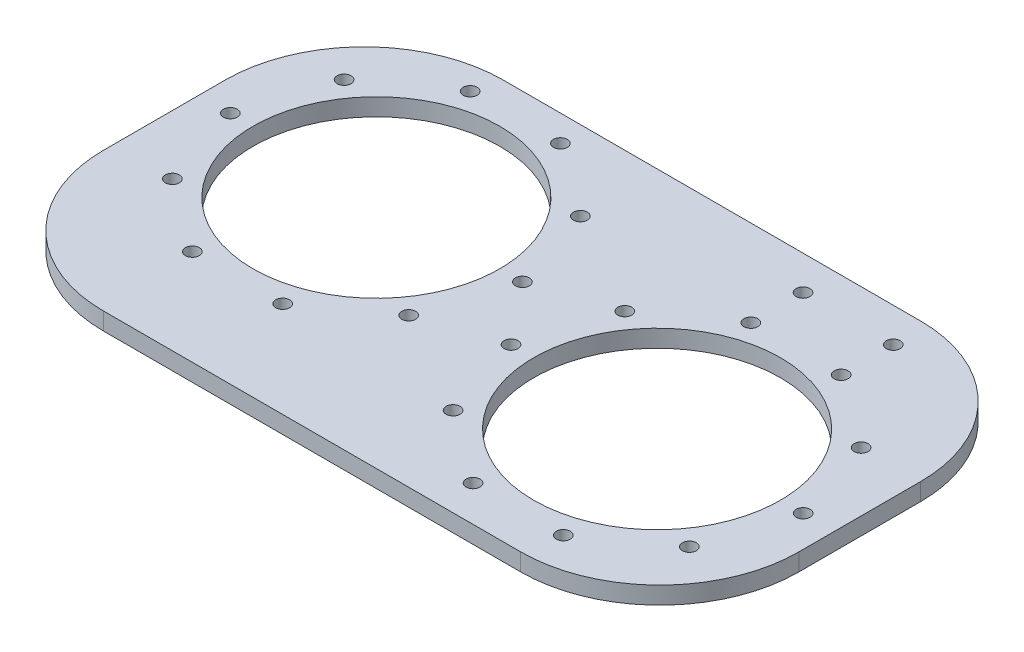
ISO-10303-21;
HEADER;
FILE_DESCRIPTION(('STEP AP214'),'2;1');
FILE_NAME('part.step','',(''),(''),'','','');
FILE_SCHEMA(('AUTOMOTIVE_DESIGN { 1 0 10303 214 1 1 1 1 }'));
ENDSEC;
DATA;
#1=APPLICATION_CONTEXT('core data for automotive mechanical design processes');
#2=APPLICATION_PROTOCOL_DEFINITION('international standard','automotive_design',2000,#1);
#3=PRODUCT_CONTEXT('',#1,'mechanical');
#4=PRODUCT('Part','Part','',(#3));
#5=PRODUCT_RELATED_PRODUCT_CATEGORY('part','',(#4));
#6=PRODUCT_DEFINITION_FORMATION('','',#4);
#7=PRODUCT_DEFINITION_CONTEXT('part definition',#1,'design');
#8=PRODUCT_DEFINITION('design','',#6,#7);
#9=PRODUCT_DEFINITION_SHAPE('','',#8);
#10=(LENGTH_UNIT() NAMED_UNIT(*) SI_UNIT(.MILLI.,.METRE.));
#11=(NAMED_UNIT(*) PLANE_ANGLE_UNIT() SI_UNIT($,.RADIAN.));
#12=(NAMED_UNIT(*) SI_UNIT($,.STERADIAN.) SOLID_ANGLE_UNIT());
#13=UNCERTAINTY_MEASURE_WITH_UNIT(LENGTH_MEASURE(1.E-05),#10,'distance_accuracy_value','');
#14=(GEOMETRIC_REPRESENTATION_CONTEXT(3) GLOBAL_UNCERTAINTY_ASSIGNED_CONTEXT((#13)) GLOBAL_UNIT_ASSIGNED_CONTEXT((#10,
#11,#12)) REPRESENTATION_CONTEXT('',''));
#15=CARTESIAN_POINT('',(0.,0.,0.));
#16=DIRECTION('',(0.,0.,1.));
#17=DIRECTION('',(1.,0.,0.));
#18=AXIS2_PLACEMENT_3D('',#15,#16,#17);
#19=CARTESIAN_POINT('',(-60.,5.,-17.5));
#20=DIRECTION('',(0.,-1.,0.));
#21=DIRECTION('',(0.,0.,-1.));
#22=AXIS2_PLACEMENT_3D('',#19,#20,#21);
#23=PLANE('',#22);
#24=CARTESIAN_POINT('',(36.021286236252,5.,-47.6643295749676));
#25=DIRECTION('',(0.,1.,0.));
#26=DIRECTION('',(0.,0.,1.));
#27=AXIS2_PLACEMENT_3D('',#24,#25,#26);
#28=CIRCLE('',#27,2.);
#29=CARTESIAN_POINT('',(36.021286236252,5.,-45.6643295749676));
#30=VERTEX_POINT('',#29);
#31=EDGE_CURVE('E270',#30,#30,#28,.T.);
#32=ORIENTED_EDGE('',*,*,#31,.F.);
#33=EDGE_LOOP('',(#32));
#34=FACE_BOUND('',#33,.T.);
#35=CARTESIAN_POINT('',(61.9787137637477,5.,-47.6643295749676));
#36=DIRECTION('',(0.,1.,0.));
#37=DIRECTION('',(0.,0.,1.));
#38=AXIS2_PLACEMENT_3D('',#35,#36,#37);
#39=CIRCLE('',#38,2.);
#40=CARTESIAN_POINT('',(61.9787137637477,5.,-45.6643295749676));
#41=VERTEX_POINT('',#40);
#42=EDGE_CURVE('E317',#41,#41,#39,.T.);
#43=ORIENTED_EDGE('',*,*,#42,.F.);
#44=EDGE_LOOP('',(#43));
#45=FACE_BOUND('',#44,.T.);
#46=CARTESIAN_POINT('',(-15.0212862362519,5.,14.6869805962834));
#47=DIRECTION('',(0.,1.,0.));
#48=DIRECTION('',(-0.587785252292462,0.,0.809016994374955));
#49=AXIS2_PLACEMENT_3D('',#46,#47,#48);
#50=CIRCLE('',#49,2.);
#51=CARTESIAN_POINT('',(-16.1968567408368,5.,16.3050145850333));
#52=VERTEX_POINT('',#51);
#53=EDGE_CURVE('E269',#52,#52,#50,.T.);
#54=ORIENTED_EDGE('',*,*,#53,.F.);
#55=EDGE_LOOP('',(#54));
#56=FACE_BOUND('',#55,.T.);
#57=CARTESIAN_POINT('',(-36.0212862362518,5.,29.9443736843963));
#58=DIRECTION('',(0.,1.,0.));
#59=DIRECTION('',(-0.95105651629515,0.,0.309016994374958));
#60=AXIS2_PLACEMENT_3D('',#57,#58,#59);
#61=CIRCLE('',#60,2.);
#62=CARTESIAN_POINT('',(-37.923399268842,5.,30.5624076731462));
#63=VERTEX_POINT('',#62);
#64=EDGE_CURVE('E276',#63,#63,#61,.T.);
#65=ORIENTED_EDGE('',*,*,#64,.F.);
#66=EDGE_LOOP('',(#65));
#67=FACE_BOUND('',#66,.T.);
#68=CARTESIAN_POINT('',(-61.9787137637474,5.,29.9443736843966));
#69=DIRECTION('',(0.,1.,0.));
#70=DIRECTION('',(-0.951056516295157,0.,-0.309016994374938));
#71=AXIS2_PLACEMENT_3D('',#68,#69,#70);
#72=CIRCLE('',#71,2.);
#73=CARTESIAN_POINT('',(-63.8808267963377,5.,29.3263396956467));
#74=VERTEX_POINT('',#73);
#75=EDGE_CURVE('E282',#74,#74,#72,.T.);
#76=ORIENTED_EDGE('',*,*,#75,.F.);
#77=EDGE_LOOP('',(#76));
#78=FACE_BOUND('',#77,.T.);
#79=CARTESIAN_POINT('',(-82.9787137637476,5.,14.6869805962842));
#80=DIRECTION('',(0.,1.,0.));
#81=DIRECTION('',(-0.58778525229248,0.,-0.809016994374942));
#82=AXIS2_PLACEMENT_3D('',#79,#80,#81);
#83=CIRCLE('',#82,2.);
#84=CARTESIAN_POINT('',(-84.1542842683325,5.,13.0689466075343));
#85=VERTEX_POINT('',#84);
#86=EDGE_CURVE('E288',#85,#85,#83,.T.);
#87=ORIENTED_EDGE('',*,*,#86,.F.);
#88=EDGE_LOOP('',(#87));
#89=FACE_BOUND('',#88,.T.);
#90=CARTESIAN_POINT('',(-91.,5.,-10.));
#91=DIRECTION('',(0.,1.,0.));
#92=DIRECTION('',(0.,0.,-1.));
#93=AXIS2_PLACEMENT_3D('',#90,#91,#92);
#94=CIRCLE('',#93,2.);
#95=CARTESIAN_POINT('',(-91.,5.,-12.));
#96=VERTEX_POINT('',#95);
#97=EDGE_CURVE('E294',#96,#96,#94,.T.);
#98=ORIENTED_EDGE('',*,*,#97,.F.);
#99=EDGE_LOOP('',(#98));
#100=FACE_BOUND('',#99,.T.);
#101=CARTESIAN_POINT('',(-82.9787137637479,5.,-34.6869805962837));
#102=DIRECTION('',(0.,1.,0.));
#103=DIRECTION('',(0.587785252292469,0.,-0.809016994374951));
#104=AXIS2_PLACEMENT_3D('',#101,#102,#103);
#105=CIRCLE('',#104,2.);
#106=CARTESIAN_POINT('',(-81.803143259163,5.,-36.3050145850336));
#107=VERTEX_POINT('',#106);
#108=EDGE_CURVE('E300',#107,#107,#105,.T.);
#109=ORIENTED_EDGE('',*,*,#108,.F.);
#110=EDGE_LOOP('',(#109));
#111=FACE_BOUND('',#110,.T.);
#112=CARTESIAN_POINT('',(-61.978713763748,5.,-49.9443736843964));
#113=DIRECTION('',(0.,1.,0.));
#114=DIRECTION('',(0.951056516295152,0.,-0.309016994374952));
#115=AXIS2_PLACEMENT_3D('',#112,#113,#114);
#116=CIRCLE('',#115,2.);
#117=CARTESIAN_POINT('',(-60.0766007311577,5.,-50.5624076731463));
#118=VERTEX_POINT('',#117);
#119=EDGE_CURVE('E306',#118,#118,#116,.T.);
#120=ORIENTED_EDGE('',*,*,#119,.F.);
#121=EDGE_LOOP('',(#120));
#122=FACE_BOUND('',#121,.T.);
#123=CARTESIAN_POINT('',(-36.0212862362523,5.,-49.9443736843965));
#124=DIRECTION('',(0.,1.,0.));
#125=DIRECTION('',(0.951056516295155,0.,0.309016994374945));
#126=AXIS2_PLACEMENT_3D('',#123,#124,#125);
#127=CIRCLE('',#126,2.);
#128=CARTESIAN_POINT('',(-34.119173203662,5.,-49.3263396956466));
#129=VERTEX_POINT('',#128);
#130=EDGE_CURVE('E263',#129,#129,#127,.T.);
#131=ORIENTED_EDGE('',*,*,#130,.F.);
#132=EDGE_LOOP('',(#131));
#133=FACE_BOUND('',#132,.T.);
#134=CARTESIAN_POINT('',(-15.0212862362522,5.,-34.6869805962839));
#135=DIRECTION('',(0.,1.,0.));
#136=DIRECTION('',(0.587785252292474,0.,0.809016994374947));
#137=AXIS2_PLACEMENT_3D('',#134,#135,#136);
#138=CIRCLE('',#137,2.);
#139=CARTESIAN_POINT('',(-13.8457157316673,5.,-33.068946607534));
#140=VERTEX_POINT('',#139);
#141=EDGE_CURVE('E257',#140,#140,#138,.T.);
#142=ORIENTED_EDGE('',*,*,#141,.F.);
#143=EDGE_LOOP('',(#142));
#144=FACE_BOUND('',#143,.T.);
#145=CARTESIAN_POINT('',(-7.,5.,-10.));
#146=DIRECTION('',(0.,1.,0.));
#147=DIRECTION('',(0.,0.,1.));
#148=AXIS2_PLACEMENT_3D('',#145,#146,#147);
#149=CIRCLE('',#148,2.);
#150=CARTESIAN_POINT('',(-7.,5.,-8.));
#151=VERTEX_POINT('',#150);
#152=EDGE_CURVE('E210',#151,#151,#149,.T.);
#153=ORIENTED_EDGE('',*,*,#152,.F.);
#154=EDGE_LOOP('',(#153));
#155=FACE_BOUND('',#154,.T.);
#156=CARTESIAN_POINT('',(82.9787137637481,5.,31.9670247057123));
#157=DIRECTION('',(0.,1.,0.));
#158=DIRECTION('',(-0.587785252292462,0.,0.809016994374955));
#159=AXIS2_PLACEMENT_3D('',#156,#157,#158);
#160=CIRCLE('',#159,2.);
#161=CARTESIAN_POINT('',(81.8031432591632,5.,33.5850586944622));
#162=VERTEX_POINT('',#161);
#163=EDGE_CURVE('E209',#162,#162,#160,.T.);
#164=ORIENTED_EDGE('',*,*,#163,.F.);
#165=EDGE_LOOP('',(#164));
#166=FACE_BOUND('',#165,.T.);
#167=CARTESIAN_POINT('',(61.9787137637482,5.,47.2244177938252));
#168=DIRECTION('',(0.,1.,0.));
#169=DIRECTION('',(-0.95105651629515,0.,0.309016994374958));
#170=AXIS2_PLACEMENT_3D('',#167,#168,#169);
#171=CIRCLE('',#170,2.);
#172=CARTESIAN_POINT('',(60.0766007311579,5.,47.8424517825751));
#173=VERTEX_POINT('',#172);
#174=EDGE_CURVE('E216',#173,#173,#171,.T.);
#175=ORIENTED_EDGE('',*,*,#174,.F.);
#176=EDGE_LOOP('',(#175));
#177=FACE_BOUND('',#176,.T.);
#178=CARTESIAN_POINT('',(36.0212862362526,5.,47.2244177938254));
#179=DIRECTION('',(0.,1.,0.));
#180=DIRECTION('',(-0.951056516295157,0.,-0.309016994374938));
#181=AXIS2_PLACEMENT_3D('',#178,#179,#180);
#182=CIRCLE('',#181,2.);
#183=CARTESIAN_POINT('',(34.1191732036623,5.,46.6063838050756));
#184=VERTEX_POINT('',#183);
#185=EDGE_CURVE('E222',#184,#184,#182,.T.);
#186=ORIENTED_EDGE('',*,*,#185,.F.);
#187=EDGE_LOOP('',(#186));
#188=FACE_BOUND('',#187,.T.);
#189=CARTESIAN_POINT('',(15.0212862362524,5.,31.967024705713));
#190=DIRECTION('',(0.,1.,0.));
#191=DIRECTION('',(-0.58778525229248,0.,-0.809016994374942));
#192=AXIS2_PLACEMENT_3D('',#189,#190,#191);
#193=CIRCLE('',#192,2.);
#194=CARTESIAN_POINT('',(13.8457157316675,5.,30.3489907169632));
#195=VERTEX_POINT('',#194);
#196=EDGE_CURVE('E228',#195,#195,#193,.T.);
#197=ORIENTED_EDGE('',*,*,#196,.F.);
#198=EDGE_LOOP('',(#197));
#199=FACE_BOUND('',#198,.T.);
#200=CARTESIAN_POINT('',(7.00000000000001,5.,7.28004410942886));
#201=DIRECTION('',(0.,1.,0.));
#202=DIRECTION('',(0.,0.,-1.));
#203=AXIS2_PLACEMENT_3D('',#200,#201,#202);
#204=CIRCLE('',#203,2.);
#205=CARTESIAN_POINT('',(7.00000000000001,5.,5.28004410942887));
#206=VERTEX_POINT('',#205);
#207=EDGE_CURVE('E234',#206,#206,#204,.T.);
#208=ORIENTED_EDGE('',*,*,#207,.F.);
#209=EDGE_LOOP('',(#208));
#210=FACE_BOUND('',#209,.T.);
#211=CARTESIAN_POINT('',(15.0212862362521,5.,-17.4069364868548));
#212=DIRECTION('',(0.,1.,0.));
#213=DIRECTION('',(0.587785252292469,0.,-0.809016994374951));
#214=AXIS2_PLACEMENT_3D('',#211,#212,#213);
#215=CIRCLE('',#214,2.);
#216=CARTESIAN_POINT('',(16.196856740837,5.,-19.0249704756047));
#217=VERTEX_POINT('',#216);
#218=EDGE_CURVE('E240',#217,#217,#215,.T.);
#219=ORIENTED_EDGE('',*,*,#218,.F.);
#220=EDGE_LOOP('',(#219));
#221=FACE_BOUND('',#220,.T.);
#222=CARTESIAN_POINT('',(36.021286236252,5.,-32.6643295749675));
#223=DIRECTION('',(0.,1.,0.));
#224=DIRECTION('',(0.951056516295152,0.,-0.309016994374952));
#225=AXIS2_PLACEMENT_3D('',#222,#223,#224);
#226=CIRCLE('',#225,2.);
#227=CARTESIAN_POINT('',(37.9233992688423,5.,-33.2823635637175));
#228=VERTEX_POINT('',#227);
#229=EDGE_CURVE('E246',#228,#228,#226,.T.);
#230=ORIENTED_EDGE('',*,*,#229,.F.);
#231=EDGE_LOOP('',(#230));
#232=FACE_BOUND('',#231,.T.);
#233=CARTESIAN_POINT('',(61.9787137637477,5.,-32.6643295749676));
#234=DIRECTION('',(0.,1.,0.));
#235=DIRECTION('',(0.951056516295155,0.,0.309016994374945));
#236=AXIS2_PLACEMENT_3D('',#233,#234,#235);
#237=CIRCLE('',#236,2.);
#238=CARTESIAN_POINT('',(63.880826796338,5.,-32.0462955862177));
#239=VERTEX_POINT('',#238);
#240=EDGE_CURVE('E203',#239,#239,#237,.T.);
#241=ORIENTED_EDGE('',*,*,#240,.F.);
#242=EDGE_LOOP('',(#241));
#243=FACE_BOUND('',#242,.T.);
#244=CARTESIAN_POINT('',(82.9787137637477,5.,-17.4069364868551));
#245=DIRECTION('',(0.,1.,0.));
#246=DIRECTION('',(0.587785252292474,0.,0.809016994374947));
#247=AXIS2_PLACEMENT_3D('',#244,#245,#246);
#248=CIRCLE('',#247,2.);
#249=CARTESIAN_POINT('',(84.1542842683327,5.,-15.7889024981052));
#250=VERTEX_POINT('',#249);
#251=EDGE_CURVE('E197',#250,#250,#248,.T.);
#252=ORIENTED_EDGE('',*,*,#251,.F.);
#253=EDGE_LOOP('',(#252));
#254=FACE_BOUND('',#253,.T.);
#255=CARTESIAN_POINT('',(91.,5.,7.28004410942886));
#256=DIRECTION('',(0.,1.,0.));
#257=DIRECTION('',(0.,0.,1.));
#258=AXIS2_PLACEMENT_3D('',#255,#256,#257);
#259=CIRCLE('',#258,2.);
#260=CARTESIAN_POINT('',(91.,5.,9.28004410942886));
#261=VERTEX_POINT('',#260);
#262=EDGE_CURVE('E191',#261,#261,#259,.T.);
#263=ORIENTED_EDGE('',*,*,#262,.F.);
#264=EDGE_LOOP('',(#263));
#265=FACE_BOUND('',#264,.T.);
#266=CARTESIAN_POINT('',(-60.,5.,-17.5));
#267=DIRECTION('',(0.,1.,0.));
#268=DIRECTION('',(0.,0.,-1.));
#269=AXIS2_PLACEMENT_3D('',#266,#267,#268);
#270=CIRCLE('',#269,40.);
#271=CARTESIAN_POINT('',(-60.,5.,-57.5));
#272=VERTEX_POINT('',#271);
#273=CARTESIAN_POINT('',(-100.,5.,-17.5));
#274=VERTEX_POINT('',#273);
#275=EDGE_CURVE('E148',#272,#274,#270,.T.);
#276=ORIENTED_EDGE('',*,*,#275,.T.);
#277=DIRECTION('',(0.,0.,1.));
#278=VECTOR('',#277,1.);
#279=CARTESIAN_POINT('',(-100.,5.,-17.5));
#280=LINE('',#279,#278);
#281=CARTESIAN_POINT('',(-100.,5.,17.5));
#282=VERTEX_POINT('',#281);
#283=EDGE_CURVE('E96',#274,#282,#280,.T.);
#284=ORIENTED_EDGE('',*,*,#283,.T.);
#285=CARTESIAN_POINT('',(-60.,5.,17.5));
#286=DIRECTION('',(0.,1.,0.));
#287=DIRECTION('',(0.,0.,-1.));
#288=AXIS2_PLACEMENT_3D('',#285,#286,#287);
#289=CIRCLE('',#288,40.);
#290=CARTESIAN_POINT('',(-60.,5.,57.5));
#291=VERTEX_POINT('',#290);
#292=EDGE_CURVE('E163',#282,#291,#289,.T.);
#293=ORIENTED_EDGE('',*,*,#292,.T.);
#294=DIRECTION('',(1.,0.,0.));
#295=VECTOR('',#294,1.);
#296=CARTESIAN_POINT('',(-60.,5.,57.5));
#297=LINE('',#296,#295);
#298=CARTESIAN_POINT('',(60.,5.,57.5));
#299=VERTEX_POINT('',#298);
#300=EDGE_CURVE('E176',#291,#299,#297,.T.);
#301=ORIENTED_EDGE('',*,*,#300,.T.);
#302=CARTESIAN_POINT('',(60.,5.,17.5));
#303=DIRECTION('',(0.,1.,0.));
#304=DIRECTION('',(0.,0.,1.));
#305=AXIS2_PLACEMENT_3D('',#302,#303,#304);
#306=CIRCLE('',#305,40.);
#307=CARTESIAN_POINT('',(100.,5.,17.5));
#308=VERTEX_POINT('',#307);
#309=EDGE_CURVE('E115',#299,#308,#306,.T.);
#310=ORIENTED_EDGE('',*,*,#309,.T.);
#311=DIRECTION('',(0.,0.,-1.));
#312=VECTOR('',#311,1.);
#313=CARTESIAN_POINT('',(100.,5.,-17.5));
#314=LINE('',#313,#312);
#315=CARTESIAN_POINT('',(100.,5.,-17.5));
#316=VERTEX_POINT('',#315);
#317=EDGE_CURVE('E109',#308,#316,#314,.T.);
#318=ORIENTED_EDGE('',*,*,#317,.T.);
#319=CARTESIAN_POINT('',(60.,5.,-17.5));
#320=DIRECTION('',(0.,1.,0.));
#321=DIRECTION('',(0.,0.,1.));
#322=AXIS2_PLACEMENT_3D('',#319,#320,#321);
#323=CIRCLE('',#322,40.);
#324=CARTESIAN_POINT('',(60.,5.,-57.5));
#325=VERTEX_POINT('',#324);
#326=EDGE_CURVE('E113',#316,#325,#323,.T.);
#327=ORIENTED_EDGE('',*,*,#326,.T.);
#328=DIRECTION('',(-1.,0.,0.));
#329=VECTOR('',#328,1.);
#330=CARTESIAN_POINT('',(-60.,5.,-57.5));
#331=LINE('',#330,#329);
#332=EDGE_CURVE('E53',#325,#272,#331,.T.);
#333=ORIENTED_EDGE('',*,*,#332,.T.);
#334=EDGE_LOOP('',(#276,#284,#293,#301,#310,#318,#327,#333));
#335=FACE_BOUND('',#334,.T.);
#336=CARTESIAN_POINT('',(-49.,5.,-10.));
#337=DIRECTION('',(0.,1.,0.));
#338=DIRECTION('',(0.,0.,1.));
#339=AXIS2_PLACEMENT_3D('',#336,#337,#338);
#340=CIRCLE('',#339,35.5);
#341=CARTESIAN_POINT('',(-49.,5.,25.5));
#342=VERTEX_POINT('',#341);
#343=EDGE_CURVE('E137',#342,#342,#340,.T.);
#344=ORIENTED_EDGE('',*,*,#343,.F.);
#345=EDGE_LOOP('',(#344));
#346=FACE_BOUND('',#345,.T.);
#347=CARTESIAN_POINT('',(49.,5.,7.28004410942886));
#348=DIRECTION('',(0.,1.,0.));
#349=DIRECTION('',(0.,0.,1.));
#350=AXIS2_PLACEMENT_3D('',#347,#348,#349);
#351=CIRCLE('',#350,35.5);
#352=CARTESIAN_POINT('',(49.,5.,42.7800441094289));
#353=VERTEX_POINT('',#352);
#354=EDGE_CURVE('E185',#353,#353,#351,.T.);
#355=ORIENTED_EDGE('',*,*,#354,.F.);
#356=EDGE_LOOP('',(#355));
#357=FACE_BOUND('',#356,.T.);
#358=ADVANCED_FACE('F36',(#34,#45,#56,#67,#78,#89,#100,#111,#122,#133,#144,#155,#166,#177,#188,
#199,#210,#221,#232,#243,#254,#265,#335,#346,#357),#23,.F.);
#359=CARTESIAN_POINT('',(-60.,0.,-17.5));
#360=DIRECTION('',(0.,-1.,0.));
#361=DIRECTION('',(0.,0.,-1.));
#362=AXIS2_PLACEMENT_3D('',#359,#360,#361);
#363=PLANE('',#362);
#364=CARTESIAN_POINT('',(36.021286236252,0.,-47.6643295749676));
#365=DIRECTION('',(0.,-1.,0.));
#366=DIRECTION('',(0.,0.,-1.));
#367=AXIS2_PLACEMENT_3D('',#364,#365,#366);
#368=CIRCLE('',#367,2.);
#369=CARTESIAN_POINT('',(36.021286236252,0.,-49.6643295749676));
#370=VERTEX_POINT('',#369);
#371=EDGE_CURVE('E320',#370,#370,#368,.F.);
#372=ORIENTED_EDGE('',*,*,#371,.T.);
#373=EDGE_LOOP('',(#372));
#374=FACE_BOUND('',#373,.T.);
#375=CARTESIAN_POINT('',(61.9787137637477,0.,-47.6643295749676));
#376=DIRECTION('',(0.,-1.,0.));
#377=DIRECTION('',(0.,0.,-1.));
#378=AXIS2_PLACEMENT_3D('',#375,#376,#377);
#379=CIRCLE('',#378,2.);
#380=CARTESIAN_POINT('',(61.9787137637477,0.,-49.6643295749676));
#381=VERTEX_POINT('',#380);
#382=EDGE_CURVE('E314',#381,#381,#379,.F.);
#383=ORIENTED_EDGE('',*,*,#382,.T.);
#384=EDGE_LOOP('',(#383));
#385=FACE_BOUND('',#384,.T.);
#386=CARTESIAN_POINT('',(-15.0212862362519,0.,14.6869805962834));
#387=DIRECTION('',(0.,-1.,0.));
#388=DIRECTION('',(0.,0.,-1.));
#389=AXIS2_PLACEMENT_3D('',#386,#387,#388);
#390=CIRCLE('',#389,2.);
#391=CARTESIAN_POINT('',(-15.0212862362519,0.,12.6869805962834));
#392=VERTEX_POINT('',#391);
#393=EDGE_CURVE('E266',#392,#392,#390,.F.);
#394=ORIENTED_EDGE('',*,*,#393,.T.);
#395=EDGE_LOOP('',(#394));
#396=FACE_BOUND('',#395,.T.);
#397=CARTESIAN_POINT('',(-36.0212862362518,0.,29.9443736843963));
#398=DIRECTION('',(0.,-1.,0.));
#399=DIRECTION('',(0.,0.,-1.));
#400=AXIS2_PLACEMENT_3D('',#397,#398,#399);
#401=CIRCLE('',#400,2.);
#402=CARTESIAN_POINT('',(-36.0212862362518,0.,27.9443736843963));
#403=VERTEX_POINT('',#402);
#404=EDGE_CURVE('E273',#403,#403,#401,.F.);
#405=ORIENTED_EDGE('',*,*,#404,.T.);
#406=EDGE_LOOP('',(#405));
#407=FACE_BOUND('',#406,.T.);
#408=CARTESIAN_POINT('',(-61.9787137637474,0.,29.9443736843966));
#409=DIRECTION('',(0.,-1.,0.));
#410=DIRECTION('',(0.,0.,-1.));
#411=AXIS2_PLACEMENT_3D('',#408,#409,#410);
#412=CIRCLE('',#411,2.);
#413=CARTESIAN_POINT('',(-61.9787137637474,0.,27.9443736843966));
#414=VERTEX_POINT('',#413);
#415=EDGE_CURVE('E279',#414,#414,#412,.F.);
#416=ORIENTED_EDGE('',*,*,#415,.T.);
#417=EDGE_LOOP('',(#416));
#418=FACE_BOUND('',#417,.T.);
#419=CARTESIAN_POINT('',(-82.9787137637476,0.,14.6869805962842));
#420=DIRECTION('',(0.,-1.,0.));
#421=DIRECTION('',(0.,0.,-1.));
#422=AXIS2_PLACEMENT_3D('',#419,#420,#421);
#423=CIRCLE('',#422,2.);
#424=CARTESIAN_POINT('',(-82.9787137637476,0.,12.6869805962842));
#425=VERTEX_POINT('',#424);
#426=EDGE_CURVE('E285',#425,#425,#423,.F.);
#427=ORIENTED_EDGE('',*,*,#426,.T.);
#428=EDGE_LOOP('',(#427));
#429=FACE_BOUND('',#428,.T.);
#430=CARTESIAN_POINT('',(-91.,0.,-10.));
#431=DIRECTION('',(0.,-1.,0.));
#432=DIRECTION('',(0.,0.,-1.));
#433=AXIS2_PLACEMENT_3D('',#430,#431,#432);
#434=CIRCLE('',#433,2.);
#435=CARTESIAN_POINT('',(-91.,0.,-12.));
#436=VERTEX_POINT('',#435);
#437=EDGE_CURVE('E291',#436,#436,#434,.F.);
#438=ORIENTED_EDGE('',*,*,#437,.T.);
#439=EDGE_LOOP('',(#438));
#440=FACE_BOUND('',#439,.T.);
#441=CARTESIAN_POINT('',(-82.9787137637479,0.,-34.6869805962837));
#442=DIRECTION('',(0.,-1.,0.));
#443=DIRECTION('',(0.,0.,-1.));
#444=AXIS2_PLACEMENT_3D('',#441,#442,#443);
#445=CIRCLE('',#444,2.);
#446=CARTESIAN_POINT('',(-82.9787137637479,0.,-36.6869805962837));
#447=VERTEX_POINT('',#446);
#448=EDGE_CURVE('E297',#447,#447,#445,.F.);
#449=ORIENTED_EDGE('',*,*,#448,.T.);
#450=EDGE_LOOP('',(#449));
#451=FACE_BOUND('',#450,.T.);
#452=CARTESIAN_POINT('',(-61.978713763748,0.,-49.9443736843964));
#453=DIRECTION('',(0.,-1.,0.));
#454=DIRECTION('',(0.,0.,-1.));
#455=AXIS2_PLACEMENT_3D('',#452,#453,#454);
#456=CIRCLE('',#455,2.);
#457=CARTESIAN_POINT('',(-61.978713763748,0.,-51.9443736843964));
#458=VERTEX_POINT('',#457);
#459=EDGE_CURVE('E303',#458,#458,#456,.F.);
#460=ORIENTED_EDGE('',*,*,#459,.T.);
#461=EDGE_LOOP('',(#460));
#462=FACE_BOUND('',#461,.T.);
#463=CARTESIAN_POINT('',(-36.0212862362523,0.,-49.9443736843965));
#464=DIRECTION('',(0.,-1.,0.));
#465=DIRECTION('',(0.,0.,-1.));
#466=AXIS2_PLACEMENT_3D('',#463,#464,#465);
#467=CIRCLE('',#466,2.);
#468=CARTESIAN_POINT('',(-36.0212862362523,0.,-51.9443736843965));
#469=VERTEX_POINT('',#468);
#470=EDGE_CURVE('E309',#469,#469,#467,.F.);
#471=ORIENTED_EDGE('',*,*,#470,.T.);
#472=EDGE_LOOP('',(#471));
#473=FACE_BOUND('',#472,.T.);
#474=CARTESIAN_POINT('',(-15.0212862362522,0.,-34.6869805962839));
#475=DIRECTION('',(0.,-1.,0.));
#476=DIRECTION('',(0.,0.,-1.));
#477=AXIS2_PLACEMENT_3D('',#474,#475,#476);
#478=CIRCLE('',#477,2.);
#479=CARTESIAN_POINT('',(-15.0212862362522,0.,-36.6869805962839));
#480=VERTEX_POINT('',#479);
#481=EDGE_CURVE('E260',#480,#480,#478,.F.);
#482=ORIENTED_EDGE('',*,*,#481,.T.);
#483=EDGE_LOOP('',(#482));
#484=FACE_BOUND('',#483,.T.);
#485=CARTESIAN_POINT('',(-7.,0.,-10.));
#486=DIRECTION('',(0.,-1.,0.));
#487=DIRECTION('',(0.,0.,-1.));
#488=AXIS2_PLACEMENT_3D('',#485,#486,#487);
#489=CIRCLE('',#488,2.);
#490=CARTESIAN_POINT('',(-7.,0.,-12.));
#491=VERTEX_POINT('',#490);
#492=EDGE_CURVE('E254',#491,#491,#489,.F.);
#493=ORIENTED_EDGE('',*,*,#492,.T.);
#494=EDGE_LOOP('',(#493));
#495=FACE_BOUND('',#494,.T.);
#496=CARTESIAN_POINT('',(82.9787137637481,0.,31.9670247057123));
#497=DIRECTION('',(0.,-1.,0.));
#498=DIRECTION('',(0.,0.,-1.));
#499=AXIS2_PLACEMENT_3D('',#496,#497,#498);
#500=CIRCLE('',#499,2.);
#501=CARTESIAN_POINT('',(82.9787137637481,0.,29.9670247057123));
#502=VERTEX_POINT('',#501);
#503=EDGE_CURVE('E206',#502,#502,#500,.F.);
#504=ORIENTED_EDGE('',*,*,#503,.T.);
#505=EDGE_LOOP('',(#504));
#506=FACE_BOUND('',#505,.T.);
#507=CARTESIAN_POINT('',(61.9787137637482,0.,47.2244177938252));
#508=DIRECTION('',(0.,-1.,0.));
#509=DIRECTION('',(0.,0.,-1.));
#510=AXIS2_PLACEMENT_3D('',#507,#508,#509);
#511=CIRCLE('',#510,2.);
#512=CARTESIAN_POINT('',(61.9787137637482,0.,45.2244177938252));
#513=VERTEX_POINT('',#512);
#514=EDGE_CURVE('E213',#513,#513,#511,.F.);
#515=ORIENTED_EDGE('',*,*,#514,.T.);
#516=EDGE_LOOP('',(#515));
#517=FACE_BOUND('',#516,.T.);
#518=CARTESIAN_POINT('',(36.0212862362526,0.,47.2244177938254));
#519=DIRECTION('',(0.,-1.,0.));
#520=DIRECTION('',(0.,0.,-1.));
#521=AXIS2_PLACEMENT_3D('',#518,#519,#520);
#522=CIRCLE('',#521,2.);
#523=CARTESIAN_POINT('',(36.0212862362526,0.,45.2244177938254));
#524=VERTEX_POINT('',#523);
#525=EDGE_CURVE('E219',#524,#524,#522,.F.);
#526=ORIENTED_EDGE('',*,*,#525,.T.);
#527=EDGE_LOOP('',(#526));
#528=FACE_BOUND('',#527,.T.);
#529=CARTESIAN_POINT('',(15.0212862362524,0.,31.967024705713));
#530=DIRECTION('',(0.,-1.,0.));
#531=DIRECTION('',(0.,0.,-1.));
#532=AXIS2_PLACEMENT_3D('',#529,#530,#531);
#533=CIRCLE('',#532,2.);
#534=CARTESIAN_POINT('',(15.0212862362524,0.,29.967024705713));
#535=VERTEX_POINT('',#534);
#536=EDGE_CURVE('E225',#535,#535,#533,.F.);
#537=ORIENTED_EDGE('',*,*,#536,.T.);
#538=EDGE_LOOP('',(#537));
#539=FACE_BOUND('',#538,.T.);
#540=CARTESIAN_POINT('',(7.00000000000001,0.,7.28004410942886));
#541=DIRECTION('',(0.,-1.,0.));
#542=DIRECTION('',(0.,0.,-1.));
#543=AXIS2_PLACEMENT_3D('',#540,#541,#542);
#544=CIRCLE('',#543,2.);
#545=CARTESIAN_POINT('',(7.00000000000001,0.,5.28004410942887));
#546=VERTEX_POINT('',#545);
#547=EDGE_CURVE('E231',#546,#546,#544,.F.);
#548=ORIENTED_EDGE('',*,*,#547,.T.);
#549=EDGE_LOOP('',(#548));
#550=FACE_BOUND('',#549,.T.);
#551=CARTESIAN_POINT('',(15.0212862362521,0.,-17.4069364868548));
#552=DIRECTION('',(0.,-1.,0.));
#553=DIRECTION('',(0.,0.,-1.));
#554=AXIS2_PLACEMENT_3D('',#551,#552,#553);
#555=CIRCLE('',#554,2.);
#556=CARTESIAN_POINT('',(15.0212862362521,0.,-19.4069364868548));
#557=VERTEX_POINT('',#556);
#558=EDGE_CURVE('E237',#557,#557,#555,.F.);
#559=ORIENTED_EDGE('',*,*,#558,.T.);
#560=EDGE_LOOP('',(#559));
#561=FACE_BOUND('',#560,.T.);
#562=CARTESIAN_POINT('',(36.021286236252,0.,-32.6643295749675));
#563=DIRECTION('',(0.,-1.,0.));
#564=DIRECTION('',(0.,0.,-1.));
#565=AXIS2_PLACEMENT_3D('',#562,#563,#564);
#566=CIRCLE('',#565,2.);
#567=CARTESIAN_POINT('',(36.021286236252,0.,-34.6643295749675));
#568=VERTEX_POINT('',#567);
#569=EDGE_CURVE('E243',#568,#568,#566,.F.);
#570=ORIENTED_EDGE('',*,*,#569,.T.);
#571=EDGE_LOOP('',(#570));
#572=FACE_BOUND('',#571,.T.);
#573=CARTESIAN_POINT('',(61.9787137637477,0.,-32.6643295749676));
#574=DIRECTION('',(0.,-1.,0.));
#575=DIRECTION('',(0.,0.,-1.));
#576=AXIS2_PLACEMENT_3D('',#573,#574,#575);
#577=CIRCLE('',#576,2.);
#578=CARTESIAN_POINT('',(61.9787137637477,0.,-34.6643295749676));
#579=VERTEX_POINT('',#578);
#580=EDGE_CURVE('E249',#579,#579,#577,.F.);
#581=ORIENTED_EDGE('',*,*,#580,.T.);
#582=EDGE_LOOP('',(#581));
#583=FACE_BOUND('',#582,.T.);
#584=CARTESIAN_POINT('',(82.9787137637477,0.,-17.4069364868551));
#585=DIRECTION('',(0.,-1.,0.));
#586=DIRECTION('',(0.,0.,-1.));
#587=AXIS2_PLACEMENT_3D('',#584,#585,#586);
#588=CIRCLE('',#587,2.);
#589=CARTESIAN_POINT('',(82.9787137637477,0.,-19.406936486855));
#590=VERTEX_POINT('',#589);
#591=EDGE_CURVE('E200',#590,#590,#588,.F.);
#592=ORIENTED_EDGE('',*,*,#591,.T.);
#593=EDGE_LOOP('',(#592));
#594=FACE_BOUND('',#593,.T.);
#595=CARTESIAN_POINT('',(91.,0.,7.28004410942886));
#596=DIRECTION('',(0.,-1.,0.));
#597=DIRECTION('',(0.,0.,-1.));
#598=AXIS2_PLACEMENT_3D('',#595,#596,#597);
#599=CIRCLE('',#598,2.);
#600=CARTESIAN_POINT('',(91.,0.,5.28004410942887));
#601=VERTEX_POINT('',#600);
#602=EDGE_CURVE('E194',#601,#601,#599,.F.);
#603=ORIENTED_EDGE('',*,*,#602,.T.);
#604=EDGE_LOOP('',(#603));
#605=FACE_BOUND('',#604,.T.);
#606=CARTESIAN_POINT('',(-49.,0.,-10.));
#607=DIRECTION('',(0.,1.,0.));
#608=DIRECTION('',(0.,0.,1.));
#609=AXIS2_PLACEMENT_3D('',#606,#607,#608);
#610=CIRCLE('',#609,35.5);
#611=CARTESIAN_POINT('',(-49.,0.,25.5));
#612=VERTEX_POINT('',#611);
#613=EDGE_CURVE('E182',#612,#612,#610,.T.);
#614=ORIENTED_EDGE('',*,*,#613,.T.);
#615=EDGE_LOOP('',(#614));
#616=FACE_BOUND('',#615,.T.);
#617=CARTESIAN_POINT('',(-60.,0.,-17.5));
#618=DIRECTION('',(0.,1.,0.));
#619=DIRECTION('',(0.,0.,-1.));
#620=AXIS2_PLACEMENT_3D('',#617,#618,#619);
#621=CIRCLE('',#620,40.);
#622=CARTESIAN_POINT('',(-60.,0.,-57.5));
#623=VERTEX_POINT('',#622);
#624=CARTESIAN_POINT('',(-100.,0.,-17.5));
#625=VERTEX_POINT('',#624);
#626=EDGE_CURVE('E133',#623,#625,#621,.T.);
#627=ORIENTED_EDGE('',*,*,#626,.F.);
#628=DIRECTION('',(-1.,0.,0.));
#629=VECTOR('',#628,1.);
#630=CARTESIAN_POINT('',(-60.,0.,-57.5));
#631=LINE('',#630,#629);
#632=CARTESIAN_POINT('',(60.,0.,-57.5));
#633=VERTEX_POINT('',#632);
#634=EDGE_CURVE('E88',#633,#623,#631,.T.);
#635=ORIENTED_EDGE('',*,*,#634,.F.);
#636=CARTESIAN_POINT('',(60.,0.,-17.5));
#637=DIRECTION('',(0.,1.,0.));
#638=DIRECTION('',(0.,0.,1.));
#639=AXIS2_PLACEMENT_3D('',#636,#637,#638);
#640=CIRCLE('',#639,40.);
#641=CARTESIAN_POINT('',(100.,0.,-17.5));
#642=VERTEX_POINT('',#641);
#643=EDGE_CURVE('E82',#642,#633,#640,.T.);
#644=ORIENTED_EDGE('',*,*,#643,.F.);
#645=DIRECTION('',(0.,0.,-1.));
#646=VECTOR('',#645,1.);
#647=CARTESIAN_POINT('',(100.,0.,-17.5));
#648=LINE('',#647,#646);
#649=CARTESIAN_POINT('',(100.,0.,17.5));
#650=VERTEX_POINT('',#649);
#651=EDGE_CURVE('E123',#650,#642,#648,.T.);
#652=ORIENTED_EDGE('',*,*,#651,.F.);
#653=CARTESIAN_POINT('',(60.,0.,17.5));
#654=DIRECTION('',(0.,1.,0.));
#655=DIRECTION('',(0.,0.,1.));
#656=AXIS2_PLACEMENT_3D('',#653,#654,#655);
#657=CIRCLE('',#656,40.);
#658=CARTESIAN_POINT('',(60.,0.,57.5));
#659=VERTEX_POINT('',#658);
#660=EDGE_CURVE('E143',#659,#650,#657,.T.);
#661=ORIENTED_EDGE('',*,*,#660,.F.);
#662=DIRECTION('',(1.,0.,0.));
#663=VECTOR('',#662,1.);
#664=CARTESIAN_POINT('',(-60.,0.,57.5));
#665=LINE('',#664,#663);
#666=CARTESIAN_POINT('',(-60.,0.,57.5));
#667=VERTEX_POINT('',#666);
#668=EDGE_CURVE('E141',#667,#659,#665,.T.);
#669=ORIENTED_EDGE('',*,*,#668,.F.);
#670=CARTESIAN_POINT('',(-60.,0.,17.5));
#671=DIRECTION('',(0.,1.,0.));
#672=DIRECTION('',(0.,0.,-1.));
#673=AXIS2_PLACEMENT_3D('',#670,#671,#672);
#674=CIRCLE('',#673,40.);
#675=CARTESIAN_POINT('',(-100.,0.,17.5));
#676=VERTEX_POINT('',#675);
#677=EDGE_CURVE('E139',#676,#667,#674,.T.);
#678=ORIENTED_EDGE('',*,*,#677,.F.);
#679=DIRECTION('',(0.,0.,1.));
#680=VECTOR('',#679,1.);
#681=CARTESIAN_POINT('',(-100.,0.,-17.5));
#682=LINE('',#681,#680);
#683=EDGE_CURVE('E136',#625,#676,#682,.T.);
#684=ORIENTED_EDGE('',*,*,#683,.F.);
#685=EDGE_LOOP('',(#627,#635,#644,#652,#661,#669,#678,#684));
#686=FACE_BOUND('',#685,.T.);
#687=CARTESIAN_POINT('',(49.,0.,7.28004410942886));
#688=DIRECTION('',(0.,1.,0.));
#689=DIRECTION('',(0.,0.,1.));
#690=AXIS2_PLACEMENT_3D('',#687,#688,#689);
#691=CIRCLE('',#690,35.5);
#692=CARTESIAN_POINT('',(49.,0.,42.7800441094289));
#693=VERTEX_POINT('',#692);
#694=EDGE_CURVE('E188',#693,#693,#691,.T.);
#695=ORIENTED_EDGE('',*,*,#694,.T.);
#696=EDGE_LOOP('',(#695));
#697=FACE_BOUND('',#696,.T.);
#698=ADVANCED_FACE('F167',(#374,#385,#396,#407,#418,#429,#440,#451,#462,#473,#484,#495,#506,
#517,#528,#539,#550,#561,#572,#583,#594,#605,#616,#686,#697),#363,.T.);
#699=CARTESIAN_POINT('',(-60.,5.,-17.5));
#700=DIRECTION('',(0.,-1.,0.));
#701=DIRECTION('',(0.,0.,-1.));
#702=AXIS2_PLACEMENT_3D('',#699,#700,#701);
#703=CYLINDRICAL_SURFACE('',#702,40.);
#704=ORIENTED_EDGE('',*,*,#626,.T.);
#705=DIRECTION('',(0.,-1.,0.));
#706=VECTOR('',#705,1.);
#707=CARTESIAN_POINT('',(-100.,5.,-17.5));
#708=LINE('',#707,#706);
#709=EDGE_CURVE('E11',#274,#625,#708,.T.);
#710=ORIENTED_EDGE('',*,*,#709,.F.);
#711=ORIENTED_EDGE('',*,*,#275,.F.);
#712=DIRECTION('',(0.,-1.,0.));
#713=VECTOR('',#712,1.);
#714=CARTESIAN_POINT('',(-60.,5.,-57.5));
#715=LINE('',#714,#713);
#716=EDGE_CURVE('E129',#272,#623,#715,.T.);
#717=ORIENTED_EDGE('',*,*,#716,.T.);
#718=EDGE_LOOP('',(#704,#710,#711,#717));
#719=FACE_BOUND('',#718,.T.);
#720=ADVANCED_FACE('F38',(#719),#703,.T.);
#721=CARTESIAN_POINT('',(-100.,5.,-17.5));
#722=DIRECTION('',(1.,0.,0.));
#723=DIRECTION('',(0.,0.,-1.));
#724=AXIS2_PLACEMENT_3D('',#721,#722,#723);
#725=PLANE('',#724);
#726=ORIENTED_EDGE('',*,*,#683,.T.);
#727=DIRECTION('',(0.,-1.,0.));
#728=VECTOR('',#727,1.);
#729=CARTESIAN_POINT('',(-100.,5.,17.5));
#730=LINE('',#729,#728);
#731=EDGE_CURVE('E45',#282,#676,#730,.T.);
#732=ORIENTED_EDGE('',*,*,#731,.F.);
#733=ORIENTED_EDGE('',*,*,#283,.F.);
#734=ORIENTED_EDGE('',*,*,#709,.T.);
#735=EDGE_LOOP('',(#726,#732,#733,#734));
#736=FACE_BOUND('',#735,.T.);
#737=ADVANCED_FACE('F410',(#736),#725,.F.);
#738=CARTESIAN_POINT('',(-60.,5.,17.5));
#739=DIRECTION('',(0.,-1.,0.));
#740=DIRECTION('',(0.,0.,-1.));
#741=AXIS2_PLACEMENT_3D('',#738,#739,#740);
#742=CYLINDRICAL_SURFACE('',#741,40.);
#743=ORIENTED_EDGE('',*,*,#677,.T.);
#744=DIRECTION('',(0.,-1.,0.));
#745=VECTOR('',#744,1.);
#746=CARTESIAN_POINT('',(-60.,5.,57.5));
#747=LINE('',#746,#745);
#748=EDGE_CURVE('E155',#291,#667,#747,.T.);
#749=ORIENTED_EDGE('',*,*,#748,.F.);
#750=ORIENTED_EDGE('',*,*,#292,.F.);
#751=ORIENTED_EDGE('',*,*,#731,.T.);
#752=EDGE_LOOP('',(#743,#749,#750,#751));
#753=FACE_BOUND('',#752,.T.);
#754=ADVANCED_FACE('F161',(#753),#742,.T.);
#755=CARTESIAN_POINT('',(-60.,5.,57.5));
#756=DIRECTION('',(0.,0.,-1.));
#757=DIRECTION('',(-1.,0.,0.));
#758=AXIS2_PLACEMENT_3D('',#755,#756,#757);
#759=PLANE('',#758);
#760=ORIENTED_EDGE('',*,*,#668,.T.);
#761=DIRECTION('',(0.,-1.,0.));
#762=VECTOR('',#761,1.);
#763=CARTESIAN_POINT('',(60.,5.,57.5));
#764=LINE('',#763,#762);
#765=EDGE_CURVE('E152',#299,#659,#764,.T.);
#766=ORIENTED_EDGE('',*,*,#765,.F.);
#767=ORIENTED_EDGE('',*,*,#300,.F.);
#768=ORIENTED_EDGE('',*,*,#748,.T.);
#769=EDGE_LOOP('',(#760,#766,#767,#768));
#770=FACE_BOUND('',#769,.T.);
#771=ADVANCED_FACE('F172',(#770),#759,.F.);
#772=CARTESIAN_POINT('',(60.,5.,17.5));
#773=DIRECTION('',(0.,-1.,0.));
#774=DIRECTION('',(0.,0.,-1.));
#775=AXIS2_PLACEMENT_3D('',#772,#773,#774);
#776=CYLINDRICAL_SURFACE('',#775,40.);
#777=ORIENTED_EDGE('',*,*,#660,.T.);
#778=DIRECTION('',(0.,-1.,0.));
#779=VECTOR('',#778,1.);
#780=CARTESIAN_POINT('',(100.,5.,17.5));
#781=LINE('',#780,#779);
#782=EDGE_CURVE('E124',#308,#650,#781,.T.);
#783=ORIENTED_EDGE('',*,*,#782,.F.);
#784=ORIENTED_EDGE('',*,*,#309,.F.);
#785=ORIENTED_EDGE('',*,*,#765,.T.);
#786=EDGE_LOOP('',(#777,#783,#784,#785));
#787=FACE_BOUND('',#786,.T.);
#788=ADVANCED_FACE('F175',(#787),#776,.T.);
#789=CARTESIAN_POINT('',(100.,5.,-17.5));
#790=DIRECTION('',(-1.,0.,0.));
#791=DIRECTION('',(0.,0.,1.));
#792=AXIS2_PLACEMENT_3D('',#789,#790,#791);
#793=PLANE('',#792);
#794=ORIENTED_EDGE('',*,*,#651,.T.);
#795=DIRECTION('',(0.,-1.,0.));
#796=VECTOR('',#795,1.);
#797=CARTESIAN_POINT('',(100.,5.,-17.5));
#798=LINE('',#797,#796);
#799=EDGE_CURVE('E120',#316,#642,#798,.T.);
#800=ORIENTED_EDGE('',*,*,#799,.F.);
#801=ORIENTED_EDGE('',*,*,#317,.F.);
#802=ORIENTED_EDGE('',*,*,#782,.T.);
#803=EDGE_LOOP('',(#794,#800,#801,#802));
#804=FACE_BOUND('',#803,.T.);
#805=ADVANCED_FACE('F121',(#804),#793,.F.);
#806=CARTESIAN_POINT('',(60.,5.,-17.5));
#807=DIRECTION('',(0.,-1.,0.));
#808=DIRECTION('',(0.,0.,-1.));
#809=AXIS2_PLACEMENT_3D('',#806,#807,#808);
#810=CYLINDRICAL_SURFACE('',#809,40.);
#811=ORIENTED_EDGE('',*,*,#643,.T.);
#812=DIRECTION('',(0.,-1.,0.));
#813=VECTOR('',#812,1.);
#814=CARTESIAN_POINT('',(60.,5.,-57.5));
#815=LINE('',#814,#813);
#816=EDGE_CURVE('E125',#325,#633,#815,.T.);
#817=ORIENTED_EDGE('',*,*,#816,.F.);
#818=ORIENTED_EDGE('',*,*,#326,.F.);
#819=ORIENTED_EDGE('',*,*,#799,.T.);
#820=EDGE_LOOP('',(#811,#817,#818,#819));
#821=FACE_BOUND('',#820,.T.);
#822=ADVANCED_FACE('F127',(#821),#810,.T.);
#823=CARTESIAN_POINT('',(-60.,5.,-57.5));
#824=DIRECTION('',(0.,0.,1.));
#825=DIRECTION('',(1.,0.,0.));
#826=AXIS2_PLACEMENT_3D('',#823,#824,#825);
#827=PLANE('',#826);
#828=ORIENTED_EDGE('',*,*,#634,.T.);
#829=ORIENTED_EDGE('',*,*,#716,.F.);
#830=ORIENTED_EDGE('',*,*,#332,.F.);
#831=ORIENTED_EDGE('',*,*,#816,.T.);
#832=EDGE_LOOP('',(#828,#829,#830,#831));
#833=FACE_BOUND('',#832,.T.);
#834=ADVANCED_FACE('F393',(#833),#827,.F.);
#835=CARTESIAN_POINT('',(-49.,5.,-10.));
#836=DIRECTION('',(0.,-1.,0.));
#837=DIRECTION('',(0.,0.,-1.));
#838=AXIS2_PLACEMENT_3D('',#835,#836,#837);
#839=CYLINDRICAL_SURFACE('',#838,35.5);
#840=ORIENTED_EDGE('',*,*,#343,.T.);
#841=EDGE_LOOP('',(#840));
#842=FACE_BOUND('',#841,.T.);
#843=ORIENTED_EDGE('',*,*,#613,.F.);
#844=EDGE_LOOP('',(#843));
#845=FACE_BOUND('',#844,.T.);
#846=ADVANCED_FACE('F386',(#842,#845),#839,.F.);
#847=CARTESIAN_POINT('',(49.,5.,7.28004410942886));
#848=DIRECTION('',(0.,-1.,0.));
#849=DIRECTION('',(0.,0.,-1.));
#850=AXIS2_PLACEMENT_3D('',#847,#848,#849);
#851=CYLINDRICAL_SURFACE('',#850,35.5);
#852=ORIENTED_EDGE('',*,*,#354,.T.);
#853=EDGE_LOOP('',(#852));
#854=FACE_BOUND('',#853,.T.);
#855=ORIENTED_EDGE('',*,*,#694,.F.);
#856=EDGE_LOOP('',(#855));
#857=FACE_BOUND('',#856,.T.);
#858=ADVANCED_FACE('F376',(#854,#857),#851,.F.);
#859=CARTESIAN_POINT('',(91.,-0.00100000000000013,7.28004410942886));
#860=DIRECTION('',(0.,1.,0.));
#861=DIRECTION('',(0.,0.,1.));
#862=AXIS2_PLACEMENT_3D('',#859,#860,#861);
#863=CYLINDRICAL_SURFACE('',#862,2.);
#864=ORIENTED_EDGE('',*,*,#602,.F.);
#865=EDGE_LOOP('',(#864));
#866=FACE_BOUND('',#865,.T.);
#867=ORIENTED_EDGE('',*,*,#262,.T.);
#868=EDGE_LOOP('',(#867));
#869=FACE_BOUND('',#868,.T.);
#870=ADVANCED_FACE('F373',(#866,#869),#863,.F.);
#871=CARTESIAN_POINT('',(82.9787137637477,-0.00100000000000013,-17.4069364868551));
#872=DIRECTION('',(0.,1.,0.));
#873=DIRECTION('',(0.,0.,1.));
#874=AXIS2_PLACEMENT_3D('',#871,#872,#873);
#875=CYLINDRICAL_SURFACE('',#874,2.);
#876=ORIENTED_EDGE('',*,*,#591,.F.);
#877=EDGE_LOOP('',(#876));
#878=FACE_BOUND('',#877,.T.);
#879=ORIENTED_EDGE('',*,*,#251,.T.);
#880=EDGE_LOOP('',(#879));
#881=FACE_BOUND('',#880,.T.);
#882=ADVANCED_FACE('F375',(#878,#881),#875,.F.);
#883=CARTESIAN_POINT('',(61.9787137637477,-0.00100000000000013,-32.6643295749676));
#884=DIRECTION('',(0.,1.,0.));
#885=DIRECTION('',(0.,0.,1.));
#886=AXIS2_PLACEMENT_3D('',#883,#884,#885);
#887=CYLINDRICAL_SURFACE('',#886,2.);
#888=ORIENTED_EDGE('',*,*,#580,.F.);
#889=EDGE_LOOP('',(#888));
#890=FACE_BOUND('',#889,.T.);
#891=ORIENTED_EDGE('',*,*,#240,.T.);
#892=EDGE_LOOP('',(#891));
#893=FACE_BOUND('',#892,.T.);
#894=ADVANCED_FACE('F383',(#890,#893),#887,.F.);
#895=CARTESIAN_POINT('',(36.021286236252,-0.00100000000000013,-32.6643295749675));
#896=DIRECTION('',(0.,1.,0.));
#897=DIRECTION('',(0.,0.,1.));
#898=AXIS2_PLACEMENT_3D('',#895,#896,#897);
#899=CYLINDRICAL_SURFACE('',#898,2.);
#900=ORIENTED_EDGE('',*,*,#569,.F.);
#901=EDGE_LOOP('',(#900));
#902=FACE_BOUND('',#901,.T.);
#903=ORIENTED_EDGE('',*,*,#229,.T.);
#904=EDGE_LOOP('',(#903));
#905=FACE_BOUND('',#904,.T.);
#906=ADVANCED_FACE('F591',(#902,#905),#899,.F.);
#907=CARTESIAN_POINT('',(15.0212862362521,-0.00100000000000013,-17.4069364868548));
#908=DIRECTION('',(0.,1.,0.));
#909=DIRECTION('',(0.,0.,1.));
#910=AXIS2_PLACEMENT_3D('',#907,#908,#909);
#911=CYLINDRICAL_SURFACE('',#910,2.);
#912=ORIENTED_EDGE('',*,*,#558,.F.);
#913=EDGE_LOOP('',(#912));
#914=FACE_BOUND('',#913,.T.);
#915=ORIENTED_EDGE('',*,*,#218,.T.);
#916=EDGE_LOOP('',(#915));
#917=FACE_BOUND('',#916,.T.);
#918=ADVANCED_FACE('F581',(#914,#917),#911,.F.);
#919=CARTESIAN_POINT('',(7.00000000000001,-0.00100000000000013,7.28004410942886));
#920=DIRECTION('',(0.,1.,0.));
#921=DIRECTION('',(0.,0.,1.));
#922=AXIS2_PLACEMENT_3D('',#919,#920,#921);
#923=CYLINDRICAL_SURFACE('',#922,2.);
#924=ORIENTED_EDGE('',*,*,#547,.F.);
#925=EDGE_LOOP('',(#924));
#926=FACE_BOUND('',#925,.T.);
#927=ORIENTED_EDGE('',*,*,#207,.T.);
#928=EDGE_LOOP('',(#927));
#929=FACE_BOUND('',#928,.T.);
#930=ADVANCED_FACE('F571',(#926,#929),#923,.F.);
#931=CARTESIAN_POINT('',(15.0212862362524,-0.00100000000000013,31.967024705713));
#932=DIRECTION('',(0.,1.,0.));
#933=DIRECTION('',(0.,0.,1.));
#934=AXIS2_PLACEMENT_3D('',#931,#932,#933);
#935=CYLINDRICAL_SURFACE('',#934,2.);
#936=ORIENTED_EDGE('',*,*,#536,.F.);
#937=EDGE_LOOP('',(#936));
#938=FACE_BOUND('',#937,.T.);
#939=ORIENTED_EDGE('',*,*,#196,.T.);
#940=EDGE_LOOP('',(#939));
#941=FACE_BOUND('',#940,.T.);
#942=ADVANCED_FACE('F561',(#938,#941),#935,.F.);
#943=CARTESIAN_POINT('',(36.0212862362526,-0.00100000000000013,47.2244177938254));
#944=DIRECTION('',(0.,1.,0.));
#945=DIRECTION('',(0.,0.,1.));
#946=AXIS2_PLACEMENT_3D('',#943,#944,#945);
#947=CYLINDRICAL_SURFACE('',#946,2.);
#948=ORIENTED_EDGE('',*,*,#525,.F.);
#949=EDGE_LOOP('',(#948));
#950=FACE_BOUND('',#949,.T.);
#951=ORIENTED_EDGE('',*,*,#185,.T.);
#952=EDGE_LOOP('',(#951));
#953=FACE_BOUND('',#952,.T.);
#954=ADVANCED_FACE('F551',(#950,#953),#947,.F.);
#955=CARTESIAN_POINT('',(61.9787137637482,-0.00100000000000013,47.2244177938252));
#956=DIRECTION('',(0.,1.,0.));
#957=DIRECTION('',(0.,0.,1.));
#958=AXIS2_PLACEMENT_3D('',#955,#956,#957);
#959=CYLINDRICAL_SURFACE('',#958,2.);
#960=ORIENTED_EDGE('',*,*,#514,.F.);
#961=EDGE_LOOP('',(#960));
#962=FACE_BOUND('',#961,.T.);
#963=ORIENTED_EDGE('',*,*,#174,.T.);
#964=EDGE_LOOP('',(#963));
#965=FACE_BOUND('',#964,.T.);
#966=ADVANCED_FACE('F542',(#962,#965),#959,.F.);
#967=CARTESIAN_POINT('',(82.9787137637481,-0.00100000000000013,31.9670247057123));
#968=DIRECTION('',(0.,1.,0.));
#969=DIRECTION('',(0.,0.,1.));
#970=AXIS2_PLACEMENT_3D('',#967,#968,#969);
#971=CYLINDRICAL_SURFACE('',#970,2.);
#972=ORIENTED_EDGE('',*,*,#503,.F.);
#973=EDGE_LOOP('',(#972));
#974=FACE_BOUND('',#973,.T.);
#975=ORIENTED_EDGE('',*,*,#163,.T.);
#976=EDGE_LOOP('',(#975));
#977=FACE_BOUND('',#976,.T.);
#978=ADVANCED_FACE('F532',(#974,#977),#971,.F.);
#979=CARTESIAN_POINT('',(-7.,-0.00100000000000013,-10.));
#980=DIRECTION('',(0.,1.,0.));
#981=DIRECTION('',(0.,0.,1.));
#982=AXIS2_PLACEMENT_3D('',#979,#980,#981);
#983=CYLINDRICAL_SURFACE('',#982,2.);
#984=ORIENTED_EDGE('',*,*,#492,.F.);
#985=EDGE_LOOP('',(#984));
#986=FACE_BOUND('',#985,.T.);
#987=ORIENTED_EDGE('',*,*,#152,.T.);
#988=EDGE_LOOP('',(#987));
#989=FACE_BOUND('',#988,.T.);
#990=ADVANCED_FACE('F522',(#986,#989),#983,.F.);
#991=CARTESIAN_POINT('',(-15.0212862362522,-0.00100000000000013,-34.6869805962839));
#992=DIRECTION('',(0.,1.,0.));
#993=DIRECTION('',(0.,0.,1.));
#994=AXIS2_PLACEMENT_3D('',#991,#992,#993);
#995=CYLINDRICAL_SURFACE('',#994,2.);
#996=ORIENTED_EDGE('',*,*,#481,.F.);
#997=EDGE_LOOP('',(#996));
#998=FACE_BOUND('',#997,.T.);
#999=ORIENTED_EDGE('',*,*,#141,.T.);
#1000=EDGE_LOOP('',(#999));
#1001=FACE_BOUND('',#1000,.T.);
#1002=ADVANCED_FACE('F512',(#998,#1001),#995,.F.);
#1003=CARTESIAN_POINT('',(-36.0212862362523,-0.00100000000000013,-49.9443736843965));
#1004=DIRECTION('',(0.,1.,0.));
#1005=DIRECTION('',(0.,0.,1.));
#1006=AXIS2_PLACEMENT_3D('',#1003,#1004,#1005);
#1007=CYLINDRICAL_SURFACE('',#1006,2.);
#1008=ORIENTED_EDGE('',*,*,#470,.F.);
#1009=EDGE_LOOP('',(#1008));
#1010=FACE_BOUND('',#1009,.T.);
#1011=ORIENTED_EDGE('',*,*,#130,.T.);
#1012=EDGE_LOOP('',(#1011));
#1013=FACE_BOUND('',#1012,.T.);
#1014=ADVANCED_FACE('F502',(#1010,#1013),#1007,.F.);
#1015=CARTESIAN_POINT('',(-61.978713763748,-0.00100000000000013,-49.9443736843964));
#1016=DIRECTION('',(0.,1.,0.));
#1017=DIRECTION('',(0.,0.,1.));
#1018=AXIS2_PLACEMENT_3D('',#1015,#1016,#1017);
#1019=CYLINDRICAL_SURFACE('',#1018,2.);
#1020=ORIENTED_EDGE('',*,*,#459,.F.);
#1021=EDGE_LOOP('',(#1020));
#1022=FACE_BOUND('',#1021,.T.);
#1023=ORIENTED_EDGE('',*,*,#119,.T.);
#1024=EDGE_LOOP('',(#1023));
#1025=FACE_BOUND('',#1024,.T.);
#1026=ADVANCED_FACE('F492',(#1022,#1025),#1019,.F.);
#1027=CARTESIAN_POINT('',(-82.9787137637479,-0.00100000000000013,-34.6869805962837));
#1028=DIRECTION('',(0.,1.,0.));
#1029=DIRECTION('',(0.,0.,1.));
#1030=AXIS2_PLACEMENT_3D('',#1027,#1028,#1029);
#1031=CYLINDRICAL_SURFACE('',#1030,2.);
#1032=ORIENTED_EDGE('',*,*,#448,.F.);
#1033=EDGE_LOOP('',(#1032));
#1034=FACE_BOUND('',#1033,.T.);
#1035=ORIENTED_EDGE('',*,*,#108,.T.);
#1036=EDGE_LOOP('',(#1035));
#1037=FACE_BOUND('',#1036,.T.);
#1038=ADVANCED_FACE('F482',(#1034,#1037),#1031,.F.);
#1039=CARTESIAN_POINT('',(-91.,-0.00100000000000013,-10.));
#1040=DIRECTION('',(0.,1.,0.));
#1041=DIRECTION('',(0.,0.,1.));
#1042=AXIS2_PLACEMENT_3D('',#1039,#1040,#1041);
#1043=CYLINDRICAL_SURFACE('',#1042,2.);
#1044=ORIENTED_EDGE('',*,*,#437,.F.);
#1045=EDGE_LOOP('',(#1044));
#1046=FACE_BOUND('',#1045,.T.);
#1047=ORIENTED_EDGE('',*,*,#97,.T.);
#1048=EDGE_LOOP('',(#1047));
#1049=FACE_BOUND('',#1048,.T.);
#1050=ADVANCED_FACE('F472',(#1046,#1049),#1043,.F.);
#1051=CARTESIAN_POINT('',(-82.9787137637476,-0.00100000000000013,14.6869805962842));
#1052=DIRECTION('',(0.,1.,0.));
#1053=DIRECTION('',(0.,0.,1.));
#1054=AXIS2_PLACEMENT_3D('',#1051,#1052,#1053);
#1055=CYLINDRICAL_SURFACE('',#1054,2.);
#1056=ORIENTED_EDGE('',*,*,#426,.F.);
#1057=EDGE_LOOP('',(#1056));
#1058=FACE_BOUND('',#1057,.T.);
#1059=ORIENTED_EDGE('',*,*,#86,.T.);
#1060=EDGE_LOOP('',(#1059));
#1061=FACE_BOUND('',#1060,.T.);
#1062=ADVANCED_FACE('F462',(#1058,#1061),#1055,.F.);
#1063=CARTESIAN_POINT('',(-61.9787137637474,-0.00100000000000013,29.9443736843966));
#1064=DIRECTION('',(0.,1.,0.));
#1065=DIRECTION('',(0.,0.,1.));
#1066=AXIS2_PLACEMENT_3D('',#1063,#1064,#1065);
#1067=CYLINDRICAL_SURFACE('',#1066,2.);
#1068=ORIENTED_EDGE('',*,*,#415,.F.);
#1069=EDGE_LOOP('',(#1068));
#1070=FACE_BOUND('',#1069,.T.);
#1071=ORIENTED_EDGE('',*,*,#75,.T.);
#1072=EDGE_LOOP('',(#1071));
#1073=FACE_BOUND('',#1072,.T.);
#1074=ADVANCED_FACE('F452',(#1070,#1073),#1067,.F.);
#1075=CARTESIAN_POINT('',(-36.0212862362518,-0.00100000000000013,29.9443736843963));
#1076=DIRECTION('',(0.,1.,0.));
#1077=DIRECTION('',(0.,0.,1.));
#1078=AXIS2_PLACEMENT_3D('',#1075,#1076,#1077);
#1079=CYLINDRICAL_SURFACE('',#1078,2.);
#1080=ORIENTED_EDGE('',*,*,#404,.F.);
#1081=EDGE_LOOP('',(#1080));
#1082=FACE_BOUND('',#1081,.T.);
#1083=ORIENTED_EDGE('',*,*,#64,.T.);
#1084=EDGE_LOOP('',(#1083));
#1085=FACE_BOUND('',#1084,.T.);
#1086=ADVANCED_FACE('F440',(#1082,#1085),#1079,.F.);
#1087=CARTESIAN_POINT('',(-15.0212862362519,-0.00100000000000013,14.6869805962834));
#1088=DIRECTION('',(0.,1.,0.));
#1089=DIRECTION('',(0.,0.,1.));
#1090=AXIS2_PLACEMENT_3D('',#1087,#1088,#1089);
#1091=CYLINDRICAL_SURFACE('',#1090,2.);
#1092=ORIENTED_EDGE('',*,*,#393,.F.);
#1093=EDGE_LOOP('',(#1092));
#1094=FACE_BOUND('',#1093,.T.);
#1095=ORIENTED_EDGE('',*,*,#53,.T.);
#1096=EDGE_LOOP('',(#1095));
#1097=FACE_BOUND('',#1096,.T.);
#1098=ADVANCED_FACE('F434',(#1094,#1097),#1091,.F.);
#1099=CARTESIAN_POINT('',(61.9787137637477,-0.00100000000000013,-47.6643295749676));
#1100=DIRECTION('',(0.,1.,0.));
#1101=DIRECTION('',(0.,0.,1.));
#1102=AXIS2_PLACEMENT_3D('',#1099,#1100,#1101);
#1103=CYLINDRICAL_SURFACE('',#1102,2.);
#1104=ORIENTED_EDGE('',*,*,#382,.F.);
#1105=EDGE_LOOP('',(#1104));
#1106=FACE_BOUND('',#1105,.T.);
#1107=ORIENTED_EDGE('',*,*,#42,.T.);
#1108=EDGE_LOOP('',(#1107));
#1109=FACE_BOUND('',#1108,.T.);
#1110=ADVANCED_FACE('F439',(#1106,#1109),#1103,.F.);
#1111=CARTESIAN_POINT('',(36.021286236252,-0.00100000000000013,-47.6643295749676));
#1112=DIRECTION('',(0.,1.,0.));
#1113=DIRECTION('',(0.,0.,1.));
#1114=AXIS2_PLACEMENT_3D('',#1111,#1112,#1113);
#1115=CYLINDRICAL_SURFACE('',#1114,2.);
#1116=ORIENTED_EDGE('',*,*,#371,.F.);
#1117=EDGE_LOOP('',(#1116));
#1118=FACE_BOUND('',#1117,.T.);
#1119=ORIENTED_EDGE('',*,*,#31,.T.);
#1120=EDGE_LOOP('',(#1119));
#1121=FACE_BOUND('',#1120,.T.);
#1122=ADVANCED_FACE('F326',(#1118,#1121),#1115,.F.);
#1123=CLOSED_SHELL('',(#358,#698,#720,#737,#754,#771,#788,#805,#822,#834,#846,#858,#870,#882,
#894,#906,#918,#930,#942,#954,#966,#978,#990,#1002,#1014,#1026,#1038,#1050,#1062,#1074,#1086,
#1098,#1110,#1122));
#1124=MANIFOLD_SOLID_BREP('B2',#1123);
#1125=ADVANCED_BREP_SHAPE_REPRESENTATION('',(#18,#1124),#14);
#1126=SHAPE_DEFINITION_REPRESENTATION(#9,#1125);
ENDSEC;
END-ISO-10303-21;
